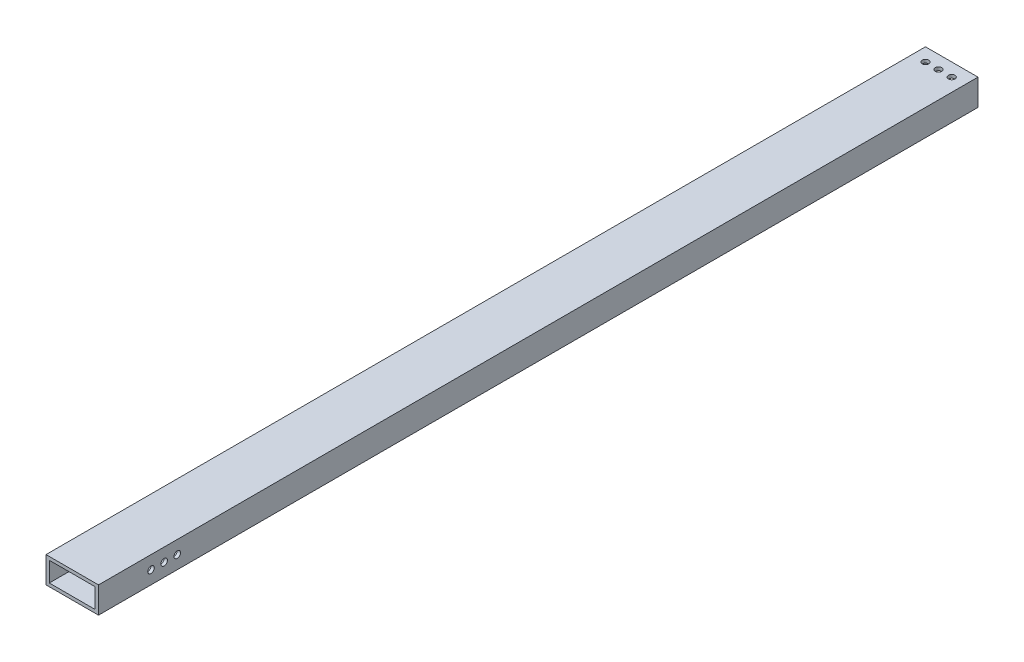
ISO-10303-21;
HEADER;
FILE_DESCRIPTION(('STEP AP214'),'2;1');
FILE_NAME('part.step','',(''),(''),'','','');
FILE_SCHEMA(('AUTOMOTIVE_DESIGN { 1 0 10303 214 1 1 1 1 }'));
ENDSEC;
DATA;
#1=APPLICATION_CONTEXT('core data for automotive mechanical design processes');
#2=APPLICATION_PROTOCOL_DEFINITION('international standard','automotive_design',2000,#1);
#3=PRODUCT_CONTEXT('',#1,'mechanical');
#4=PRODUCT('Part','Part','',(#3));
#5=PRODUCT_RELATED_PRODUCT_CATEGORY('part','',(#4));
#6=PRODUCT_DEFINITION_FORMATION('','',#4);
#7=PRODUCT_DEFINITION_CONTEXT('part definition',#1,'design');
#8=PRODUCT_DEFINITION('design','',#6,#7);
#9=PRODUCT_DEFINITION_SHAPE('','',#8);
#10=(LENGTH_UNIT() NAMED_UNIT(*) SI_UNIT(.MILLI.,.METRE.));
#11=(NAMED_UNIT(*) PLANE_ANGLE_UNIT() SI_UNIT($,.RADIAN.));
#12=(NAMED_UNIT(*) SI_UNIT($,.STERADIAN.) SOLID_ANGLE_UNIT());
#13=UNCERTAINTY_MEASURE_WITH_UNIT(LENGTH_MEASURE(1.E-05),#10,'distance_accuracy_value','');
#14=(GEOMETRIC_REPRESENTATION_CONTEXT(3) GLOBAL_UNCERTAINTY_ASSIGNED_CONTEXT((#13)) GLOBAL_UNIT_ASSIGNED_CONTEXT((#10,
#11,#12)) REPRESENTATION_CONTEXT('',''));
#15=CARTESIAN_POINT('',(0.,0.,0.));
#16=DIRECTION('',(0.,0.,1.));
#17=DIRECTION('',(1.,0.,0.));
#18=AXIS2_PLACEMENT_3D('',#15,#16,#17);
#19=CARTESIAN_POINT('',(0.,0.,850.9));
#20=DIRECTION('',(0.,0.,-1.));
#21=DIRECTION('',(-1.,0.,0.));
#22=AXIS2_PLACEMENT_3D('',#19,#20,#21);
#23=PLANE('',#22);
#24=DIRECTION('',(0.,-1.,0.));
#25=VECTOR('',#24,1.);
#26=CARTESIAN_POINT('',(0.,0.,850.9));
#27=LINE('',#26,#25);
#28=CARTESIAN_POINT('',(0.,25.4,850.9));
#29=VERTEX_POINT('',#28);
#30=CARTESIAN_POINT('',(0.,0.,850.9));
#31=VERTEX_POINT('',#30);
#32=EDGE_CURVE('E144',#29,#31,#27,.T.);
#33=ORIENTED_EDGE('',*,*,#32,.T.);
#34=DIRECTION('',(1.,0.,0.));
#35=VECTOR('',#34,1.);
#36=CARTESIAN_POINT('',(0.,0.,850.9));
#37=LINE('',#36,#35);
#38=CARTESIAN_POINT('',(50.8,0.,850.9));
#39=VERTEX_POINT('',#38);
#40=EDGE_CURVE('E147',#31,#39,#37,.T.);
#41=ORIENTED_EDGE('',*,*,#40,.T.);
#42=DIRECTION('',(0.,1.,0.));
#43=VECTOR('',#42,1.);
#44=CARTESIAN_POINT('',(50.8,0.,850.9));
#45=LINE('',#44,#43);
#46=CARTESIAN_POINT('',(50.8,25.4,850.9));
#47=VERTEX_POINT('',#46);
#48=EDGE_CURVE('E150',#39,#47,#45,.T.);
#49=ORIENTED_EDGE('',*,*,#48,.T.);
#50=DIRECTION('',(-1.,0.,0.));
#51=VECTOR('',#50,1.);
#52=CARTESIAN_POINT('',(0.,25.4,850.9));
#53=LINE('',#52,#51);
#54=EDGE_CURVE('E152',#47,#29,#53,.T.);
#55=ORIENTED_EDGE('',*,*,#54,.T.);
#56=EDGE_LOOP('',(#33,#41,#49,#55));
#57=FACE_BOUND('',#56,.T.);
#58=DIRECTION('',(0.,-1.,0.));
#59=VECTOR('',#58,1.);
#60=CARTESIAN_POINT('',(3.175,3.175,850.9));
#61=LINE('',#60,#59);
#62=CARTESIAN_POINT('',(3.175,22.225,850.9));
#63=VERTEX_POINT('',#62);
#64=CARTESIAN_POINT('',(3.175,3.175,850.9));
#65=VERTEX_POINT('',#64);
#66=EDGE_CURVE('E106',#63,#65,#61,.T.);
#67=ORIENTED_EDGE('',*,*,#66,.F.);
#68=DIRECTION('',(-1.,0.,0.));
#69=VECTOR('',#68,1.);
#70=CARTESIAN_POINT('',(3.175,22.225,850.9));
#71=LINE('',#70,#69);
#72=CARTESIAN_POINT('',(47.625,22.225,850.9));
#73=VERTEX_POINT('',#72);
#74=EDGE_CURVE('E128',#73,#63,#71,.T.);
#75=ORIENTED_EDGE('',*,*,#74,.F.);
#76=DIRECTION('',(0.,1.,0.));
#77=VECTOR('',#76,1.);
#78=CARTESIAN_POINT('',(47.625,3.175,850.9));
#79=LINE('',#78,#77);
#80=CARTESIAN_POINT('',(47.625,3.175,850.9));
#81=VERTEX_POINT('',#80);
#82=EDGE_CURVE('E126',#81,#73,#79,.T.);
#83=ORIENTED_EDGE('',*,*,#82,.F.);
#84=DIRECTION('',(1.,0.,0.));
#85=VECTOR('',#84,1.);
#86=CARTESIAN_POINT('',(3.175,3.175,850.9));
#87=LINE('',#86,#85);
#88=EDGE_CURVE('E114',#65,#81,#87,.T.);
#89=ORIENTED_EDGE('',*,*,#88,.F.);
#90=EDGE_LOOP('',(#67,#75,#83,#89));
#91=FACE_BOUND('',#90,.T.);
#92=ADVANCED_FACE('F39',(#57,#91),#23,.F.);
#93=CARTESIAN_POINT('',(0.,0.,0.));
#94=DIRECTION('',(0.,0.,-1.));
#95=DIRECTION('',(-1.,0.,0.));
#96=AXIS2_PLACEMENT_3D('',#93,#94,#95);
#97=PLANE('',#96);
#98=DIRECTION('',(0.,-1.,0.));
#99=VECTOR('',#98,1.);
#100=CARTESIAN_POINT('',(0.,0.,0.));
#101=LINE('',#100,#99);
#102=CARTESIAN_POINT('',(0.,25.4,0.));
#103=VERTEX_POINT('',#102);
#104=CARTESIAN_POINT('',(0.,0.,0.));
#105=VERTEX_POINT('',#104);
#106=EDGE_CURVE('E122',#103,#105,#101,.T.);
#107=ORIENTED_EDGE('',*,*,#106,.F.);
#108=DIRECTION('',(-1.,0.,0.));
#109=VECTOR('',#108,1.);
#110=CARTESIAN_POINT('',(0.,25.4,0.));
#111=LINE('',#110,#109);
#112=CARTESIAN_POINT('',(50.8,25.4,0.));
#113=VERTEX_POINT('',#112);
#114=EDGE_CURVE('E148',#113,#103,#111,.T.);
#115=ORIENTED_EDGE('',*,*,#114,.F.);
#116=DIRECTION('',(0.,1.,0.));
#117=VECTOR('',#116,1.);
#118=CARTESIAN_POINT('',(50.8,0.,0.));
#119=LINE('',#118,#117);
#120=CARTESIAN_POINT('',(50.8,0.,0.));
#121=VERTEX_POINT('',#120);
#122=EDGE_CURVE('E159',#121,#113,#119,.T.);
#123=ORIENTED_EDGE('',*,*,#122,.F.);
#124=DIRECTION('',(1.,0.,0.));
#125=VECTOR('',#124,1.);
#126=CARTESIAN_POINT('',(0.,0.,0.));
#127=LINE('',#126,#125);
#128=EDGE_CURVE('E157',#105,#121,#127,.T.);
#129=ORIENTED_EDGE('',*,*,#128,.F.);
#130=EDGE_LOOP('',(#107,#115,#123,#129));
#131=FACE_BOUND('',#130,.T.);
#132=DIRECTION('',(-1.,0.,0.));
#133=VECTOR('',#132,1.);
#134=CARTESIAN_POINT('',(3.175,22.225,0.));
#135=LINE('',#134,#133);
#136=CARTESIAN_POINT('',(47.625,22.225,0.));
#137=VERTEX_POINT('',#136);
#138=CARTESIAN_POINT('',(3.175,22.225,0.));
#139=VERTEX_POINT('',#138);
#140=EDGE_CURVE('E115',#137,#139,#135,.T.);
#141=ORIENTED_EDGE('',*,*,#140,.T.);
#142=DIRECTION('',(0.,-1.,0.));
#143=VECTOR('',#142,1.);
#144=CARTESIAN_POINT('',(3.175,3.175,0.));
#145=LINE('',#144,#143);
#146=CARTESIAN_POINT('',(3.175,3.175,0.));
#147=VERTEX_POINT('',#146);
#148=EDGE_CURVE('E64',#139,#147,#145,.T.);
#149=ORIENTED_EDGE('',*,*,#148,.T.);
#150=DIRECTION('',(1.,0.,0.));
#151=VECTOR('',#150,1.);
#152=CARTESIAN_POINT('',(3.175,3.175,0.));
#153=LINE('',#152,#151);
#154=CARTESIAN_POINT('',(47.625,3.175,0.));
#155=VERTEX_POINT('',#154);
#156=EDGE_CURVE('E121',#147,#155,#153,.T.);
#157=ORIENTED_EDGE('',*,*,#156,.T.);
#158=DIRECTION('',(0.,1.,0.));
#159=VECTOR('',#158,1.);
#160=CARTESIAN_POINT('',(47.625,3.175,0.));
#161=LINE('',#160,#159);
#162=EDGE_CURVE('E136',#155,#137,#161,.T.);
#163=ORIENTED_EDGE('',*,*,#162,.T.);
#164=EDGE_LOOP('',(#141,#149,#157,#163));
#165=FACE_BOUND('',#164,.T.);
#166=ADVANCED_FACE('F246',(#131,#165),#97,.T.);
#167=CARTESIAN_POINT('',(0.,0.,850.9));
#168=DIRECTION('',(1.,0.,0.));
#169=DIRECTION('',(0.,0.,-1.));
#170=AXIS2_PLACEMENT_3D('',#167,#168,#169);
#171=PLANE('',#170);
#172=CARTESIAN_POINT('',(0.,12.7,800.1));
#173=DIRECTION('',(1.,0.,0.));
#174=DIRECTION('',(0.,0.,-1.));
#175=AXIS2_PLACEMENT_3D('',#172,#173,#174);
#176=CIRCLE('',#175,3.17500000000008);
#177=CARTESIAN_POINT('',(0.,12.7,796.925));
#178=VERTEX_POINT('',#177);
#179=EDGE_CURVE('E173',#178,#178,#176,.T.);
#180=ORIENTED_EDGE('',*,*,#179,.T.);
#181=EDGE_LOOP('',(#180));
#182=FACE_BOUND('',#181,.T.);
#183=CARTESIAN_POINT('',(0.,12.7,787.4));
#184=DIRECTION('',(1.,0.,0.));
#185=DIRECTION('',(0.,0.,-1.));
#186=AXIS2_PLACEMENT_3D('',#183,#184,#185);
#187=CIRCLE('',#186,3.17500000000008);
#188=CARTESIAN_POINT('',(0.,12.7,784.225));
#189=VERTEX_POINT('',#188);
#190=EDGE_CURVE('E204',#189,#189,#187,.T.);
#191=ORIENTED_EDGE('',*,*,#190,.T.);
#192=EDGE_LOOP('',(#191));
#193=FACE_BOUND('',#192,.T.);
#194=CARTESIAN_POINT('',(0.,12.7,774.7));
#195=DIRECTION('',(1.,0.,0.));
#196=DIRECTION('',(0.,0.,-1.));
#197=AXIS2_PLACEMENT_3D('',#194,#195,#196);
#198=CIRCLE('',#197,3.17500000000008);
#199=CARTESIAN_POINT('',(0.,12.7,771.525));
#200=VERTEX_POINT('',#199);
#201=EDGE_CURVE('E190',#200,#200,#198,.T.);
#202=ORIENTED_EDGE('',*,*,#201,.T.);
#203=EDGE_LOOP('',(#202));
#204=FACE_BOUND('',#203,.T.);
#205=ORIENTED_EDGE('',*,*,#106,.T.);
#206=DIRECTION('',(0.,0.,-1.));
#207=VECTOR('',#206,1.);
#208=CARTESIAN_POINT('',(0.,0.,850.9));
#209=LINE('',#208,#207);
#210=EDGE_CURVE('E11',#31,#105,#209,.T.);
#211=ORIENTED_EDGE('',*,*,#210,.F.);
#212=ORIENTED_EDGE('',*,*,#32,.F.);
#213=DIRECTION('',(0.,0.,-1.));
#214=VECTOR('',#213,1.);
#215=CARTESIAN_POINT('',(0.,25.4,850.9));
#216=LINE('',#215,#214);
#217=EDGE_CURVE('E154',#29,#103,#216,.T.);
#218=ORIENTED_EDGE('',*,*,#217,.T.);
#219=EDGE_LOOP('',(#205,#211,#212,#218));
#220=FACE_BOUND('',#219,.T.);
#221=ADVANCED_FACE('F41',(#182,#193,#204,#220),#171,.F.);
#222=CARTESIAN_POINT('',(0.,0.,850.9));
#223=DIRECTION('',(0.,1.,0.));
#224=DIRECTION('',(0.,0.,1.));
#225=AXIS2_PLACEMENT_3D('',#222,#223,#224);
#226=PLANE('',#225);
#227=CARTESIAN_POINT('',(12.7,0.,12.7));
#228=DIRECTION('',(0.,1.,0.));
#229=DIRECTION('',(0.,0.,1.));
#230=AXIS2_PLACEMENT_3D('',#227,#228,#229);
#231=CIRCLE('',#230,3.17499999999999);
#232=CARTESIAN_POINT('',(12.7,0.,15.875));
#233=VERTEX_POINT('',#232);
#234=EDGE_CURVE('E272',#233,#233,#231,.T.);
#235=ORIENTED_EDGE('',*,*,#234,.T.);
#236=EDGE_LOOP('',(#235));
#237=FACE_BOUND('',#236,.T.);
#238=CARTESIAN_POINT('',(25.4,0.,12.7));
#239=DIRECTION('',(0.,1.,0.));
#240=DIRECTION('',(0.,0.,1.));
#241=AXIS2_PLACEMENT_3D('',#238,#239,#240);
#242=CIRCLE('',#241,3.17499999999999);
#243=CARTESIAN_POINT('',(25.4,0.,15.875));
#244=VERTEX_POINT('',#243);
#245=EDGE_CURVE('E275',#244,#244,#242,.T.);
#246=ORIENTED_EDGE('',*,*,#245,.T.);
#247=EDGE_LOOP('',(#246));
#248=FACE_BOUND('',#247,.T.);
#249=CARTESIAN_POINT('',(38.1,0.,12.7));
#250=DIRECTION('',(0.,1.,0.));
#251=DIRECTION('',(0.,0.,1.));
#252=AXIS2_PLACEMENT_3D('',#249,#250,#251);
#253=CIRCLE('',#252,3.175);
#254=CARTESIAN_POINT('',(38.1,0.,15.875));
#255=VERTEX_POINT('',#254);
#256=EDGE_CURVE('E186',#255,#255,#253,.T.);
#257=ORIENTED_EDGE('',*,*,#256,.T.);
#258=EDGE_LOOP('',(#257));
#259=FACE_BOUND('',#258,.T.);
#260=ORIENTED_EDGE('',*,*,#128,.T.);
#261=DIRECTION('',(0.,0.,-1.));
#262=VECTOR('',#261,1.);
#263=CARTESIAN_POINT('',(50.8,0.,850.9));
#264=LINE('',#263,#262);
#265=EDGE_CURVE('E48',#39,#121,#264,.T.);
#266=ORIENTED_EDGE('',*,*,#265,.F.);
#267=ORIENTED_EDGE('',*,*,#40,.F.);
#268=ORIENTED_EDGE('',*,*,#210,.T.);
#269=EDGE_LOOP('',(#260,#266,#267,#268));
#270=FACE_BOUND('',#269,.T.);
#271=ADVANCED_FACE('F262',(#237,#248,#259,#270),#226,.F.);
#272=CARTESIAN_POINT('',(50.8,0.,850.9));
#273=DIRECTION('',(-1.,0.,0.));
#274=DIRECTION('',(0.,0.,1.));
#275=AXIS2_PLACEMENT_3D('',#272,#273,#274);
#276=PLANE('',#275);
#277=CARTESIAN_POINT('',(50.8,12.7,800.1));
#278=DIRECTION('',(-1.,0.,0.));
#279=DIRECTION('',(0.,0.,1.));
#280=AXIS2_PLACEMENT_3D('',#277,#278,#279);
#281=CIRCLE('',#280,3.17500000000008);
#282=CARTESIAN_POINT('',(50.8,12.7,803.275));
#283=VERTEX_POINT('',#282);
#284=EDGE_CURVE('E134',#283,#283,#281,.T.);
#285=ORIENTED_EDGE('',*,*,#284,.T.);
#286=EDGE_LOOP('',(#285));
#287=FACE_BOUND('',#286,.T.);
#288=CARTESIAN_POINT('',(50.8,12.7,787.4));
#289=DIRECTION('',(-1.,0.,0.));
#290=DIRECTION('',(0.,0.,1.));
#291=AXIS2_PLACEMENT_3D('',#288,#289,#290);
#292=CIRCLE('',#291,3.17500000000008);
#293=CARTESIAN_POINT('',(50.8,12.7,790.575));
#294=VERTEX_POINT('',#293);
#295=EDGE_CURVE('E182',#294,#294,#292,.T.);
#296=ORIENTED_EDGE('',*,*,#295,.T.);
#297=EDGE_LOOP('',(#296));
#298=FACE_BOUND('',#297,.T.);
#299=CARTESIAN_POINT('',(50.8,12.7,774.7));
#300=DIRECTION('',(-1.,0.,0.));
#301=DIRECTION('',(0.,0.,1.));
#302=AXIS2_PLACEMENT_3D('',#299,#300,#301);
#303=CIRCLE('',#302,3.17500000000008);
#304=CARTESIAN_POINT('',(50.8,12.7,777.875));
#305=VERTEX_POINT('',#304);
#306=EDGE_CURVE('E178',#305,#305,#303,.T.);
#307=ORIENTED_EDGE('',*,*,#306,.T.);
#308=EDGE_LOOP('',(#307));
#309=FACE_BOUND('',#308,.T.);
#310=ORIENTED_EDGE('',*,*,#122,.T.);
#311=DIRECTION('',(0.,0.,-1.));
#312=VECTOR('',#311,1.);
#313=CARTESIAN_POINT('',(50.8,25.4,850.9));
#314=LINE('',#313,#312);
#315=EDGE_CURVE('E164',#47,#113,#314,.T.);
#316=ORIENTED_EDGE('',*,*,#315,.F.);
#317=ORIENTED_EDGE('',*,*,#48,.F.);
#318=ORIENTED_EDGE('',*,*,#265,.T.);
#319=EDGE_LOOP('',(#310,#316,#317,#318));
#320=FACE_BOUND('',#319,.T.);
#321=ADVANCED_FACE('F221',(#287,#298,#309,#320),#276,.F.);
#322=CARTESIAN_POINT('',(0.,25.4,850.9));
#323=DIRECTION('',(0.,-1.,0.));
#324=DIRECTION('',(0.,0.,-1.));
#325=AXIS2_PLACEMENT_3D('',#322,#323,#324);
#326=PLANE('',#325);
#327=CARTESIAN_POINT('',(12.7,25.4,12.7));
#328=DIRECTION('',(0.,1.,0.));
#329=DIRECTION('',(0.,0.,1.));
#330=AXIS2_PLACEMENT_3D('',#327,#328,#329);
#331=CIRCLE('',#330,3.175);
#332=CARTESIAN_POINT('',(12.7,25.4,15.875));
#333=VERTEX_POINT('',#332);
#334=EDGE_CURVE('E347',#333,#333,#331,.T.);
#335=ORIENTED_EDGE('',*,*,#334,.F.);
#336=EDGE_LOOP('',(#335));
#337=FACE_BOUND('',#336,.T.);
#338=CARTESIAN_POINT('',(25.4,25.4,12.7));
#339=DIRECTION('',(0.,1.,0.));
#340=DIRECTION('',(0.,0.,1.));
#341=AXIS2_PLACEMENT_3D('',#338,#339,#340);
#342=CIRCLE('',#341,3.175);
#343=CARTESIAN_POINT('',(25.4,25.4,15.875));
#344=VERTEX_POINT('',#343);
#345=EDGE_CURVE('E352',#344,#344,#342,.T.);
#346=ORIENTED_EDGE('',*,*,#345,.F.);
#347=EDGE_LOOP('',(#346));
#348=FACE_BOUND('',#347,.T.);
#349=CARTESIAN_POINT('',(38.1,25.4,12.7));
#350=DIRECTION('',(0.,1.,0.));
#351=DIRECTION('',(0.,0.,1.));
#352=AXIS2_PLACEMENT_3D('',#349,#350,#351);
#353=CIRCLE('',#352,3.175);
#354=CARTESIAN_POINT('',(38.1,25.4,15.875));
#355=VERTEX_POINT('',#354);
#356=EDGE_CURVE('E193',#355,#355,#353,.T.);
#357=ORIENTED_EDGE('',*,*,#356,.F.);
#358=EDGE_LOOP('',(#357));
#359=FACE_BOUND('',#358,.T.);
#360=ORIENTED_EDGE('',*,*,#114,.T.);
#361=ORIENTED_EDGE('',*,*,#217,.F.);
#362=ORIENTED_EDGE('',*,*,#54,.F.);
#363=ORIENTED_EDGE('',*,*,#315,.T.);
#364=EDGE_LOOP('',(#360,#361,#362,#363));
#365=FACE_BOUND('',#364,.T.);
#366=ADVANCED_FACE('F257',(#337,#348,#359,#365),#326,.F.);
#367=CARTESIAN_POINT('',(3.175,3.175,850.9));
#368=DIRECTION('',(1.,0.,0.));
#369=DIRECTION('',(0.,0.,-1.));
#370=AXIS2_PLACEMENT_3D('',#367,#368,#369);
#371=PLANE('',#370);
#372=CARTESIAN_POINT('',(3.175,12.7,800.1));
#373=DIRECTION('',(1.,0.,0.));
#374=DIRECTION('',(0.,0.,-1.));
#375=AXIS2_PLACEMENT_3D('',#372,#373,#374);
#376=CIRCLE('',#375,3.17500000000008);
#377=CARTESIAN_POINT('',(3.175,12.7,796.925));
#378=VERTEX_POINT('',#377);
#379=EDGE_CURVE('E181',#378,#378,#376,.T.);
#380=ORIENTED_EDGE('',*,*,#379,.F.);
#381=EDGE_LOOP('',(#380));
#382=FACE_BOUND('',#381,.T.);
#383=CARTESIAN_POINT('',(3.175,12.7,787.4));
#384=DIRECTION('',(1.,0.,0.));
#385=DIRECTION('',(0.,0.,-1.));
#386=AXIS2_PLACEMENT_3D('',#383,#384,#385);
#387=CIRCLE('',#386,3.17500000000008);
#388=CARTESIAN_POINT('',(3.175,12.7,784.225));
#389=VERTEX_POINT('',#388);
#390=EDGE_CURVE('E177',#389,#389,#387,.T.);
#391=ORIENTED_EDGE('',*,*,#390,.F.);
#392=EDGE_LOOP('',(#391));
#393=FACE_BOUND('',#392,.T.);
#394=CARTESIAN_POINT('',(3.175,12.7,774.7));
#395=DIRECTION('',(1.,0.,0.));
#396=DIRECTION('',(0.,0.,-1.));
#397=AXIS2_PLACEMENT_3D('',#394,#395,#396);
#398=CIRCLE('',#397,3.17500000000008);
#399=CARTESIAN_POINT('',(3.175,12.7,771.525));
#400=VERTEX_POINT('',#399);
#401=EDGE_CURVE('E172',#400,#400,#398,.T.);
#402=ORIENTED_EDGE('',*,*,#401,.F.);
#403=EDGE_LOOP('',(#402));
#404=FACE_BOUND('',#403,.T.);
#405=ORIENTED_EDGE('',*,*,#148,.F.);
#406=DIRECTION('',(0.,0.,-1.));
#407=VECTOR('',#406,1.);
#408=CARTESIAN_POINT('',(3.175,22.225,850.9));
#409=LINE('',#408,#407);
#410=EDGE_CURVE('E110',#63,#139,#409,.T.);
#411=ORIENTED_EDGE('',*,*,#410,.F.);
#412=ORIENTED_EDGE('',*,*,#66,.T.);
#413=DIRECTION('',(0.,0.,-1.));
#414=VECTOR('',#413,1.);
#415=CARTESIAN_POINT('',(3.175,3.175,850.9));
#416=LINE('',#415,#414);
#417=EDGE_CURVE('E109',#65,#147,#416,.T.);
#418=ORIENTED_EDGE('',*,*,#417,.T.);
#419=EDGE_LOOP('',(#405,#411,#412,#418));
#420=FACE_BOUND('',#419,.T.);
#421=ADVANCED_FACE('F108',(#382,#393,#404,#420),#371,.T.);
#422=CARTESIAN_POINT('',(3.175,3.175,850.9));
#423=DIRECTION('',(0.,1.,0.));
#424=DIRECTION('',(0.,0.,1.));
#425=AXIS2_PLACEMENT_3D('',#422,#423,#424);
#426=PLANE('',#425);
#427=CARTESIAN_POINT('',(12.7,3.175,12.7));
#428=DIRECTION('',(0.,1.,0.));
#429=DIRECTION('',(0.,0.,1.));
#430=AXIS2_PLACEMENT_3D('',#427,#428,#429);
#431=CIRCLE('',#430,3.175);
#432=CARTESIAN_POINT('',(12.7,3.175,15.875));
#433=VERTEX_POINT('',#432);
#434=EDGE_CURVE('E316',#433,#433,#431,.T.);
#435=ORIENTED_EDGE('',*,*,#434,.F.);
#436=EDGE_LOOP('',(#435));
#437=FACE_BOUND('',#436,.T.);
#438=CARTESIAN_POINT('',(25.4,3.175,12.7));
#439=DIRECTION('',(0.,1.,0.));
#440=DIRECTION('',(0.,0.,1.));
#441=AXIS2_PLACEMENT_3D('',#438,#439,#440);
#442=CIRCLE('',#441,3.175);
#443=CARTESIAN_POINT('',(25.4,3.175,15.875));
#444=VERTEX_POINT('',#443);
#445=EDGE_CURVE('E198',#444,#444,#442,.T.);
#446=ORIENTED_EDGE('',*,*,#445,.F.);
#447=EDGE_LOOP('',(#446));
#448=FACE_BOUND('',#447,.T.);
#449=CARTESIAN_POINT('',(38.1,3.175,12.7));
#450=DIRECTION('',(0.,1.,0.));
#451=DIRECTION('',(0.,0.,1.));
#452=AXIS2_PLACEMENT_3D('',#449,#450,#451);
#453=CIRCLE('',#452,3.175);
#454=CARTESIAN_POINT('',(38.1,3.175,15.875));
#455=VERTEX_POINT('',#454);
#456=EDGE_CURVE('E185',#455,#455,#453,.T.);
#457=ORIENTED_EDGE('',*,*,#456,.F.);
#458=EDGE_LOOP('',(#457));
#459=FACE_BOUND('',#458,.T.);
#460=ORIENTED_EDGE('',*,*,#156,.F.);
#461=ORIENTED_EDGE('',*,*,#417,.F.);
#462=ORIENTED_EDGE('',*,*,#88,.T.);
#463=DIRECTION('',(0.,0.,-1.));
#464=VECTOR('',#463,1.);
#465=CARTESIAN_POINT('',(47.625,3.175,850.9));
#466=LINE('',#465,#464);
#467=EDGE_CURVE('E123',#81,#155,#466,.T.);
#468=ORIENTED_EDGE('',*,*,#467,.T.);
#469=EDGE_LOOP('',(#460,#461,#462,#468));
#470=FACE_BOUND('',#469,.T.);
#471=ADVANCED_FACE('F118',(#437,#448,#459,#470),#426,.T.);
#472=CARTESIAN_POINT('',(47.625,3.175,850.9));
#473=DIRECTION('',(-1.,0.,0.));
#474=DIRECTION('',(0.,0.,1.));
#475=AXIS2_PLACEMENT_3D('',#472,#473,#474);
#476=PLANE('',#475);
#477=CARTESIAN_POINT('',(47.625,12.7,800.1));
#478=DIRECTION('',(-1.,0.,0.));
#479=DIRECTION('',(0.,0.,1.));
#480=AXIS2_PLACEMENT_3D('',#477,#478,#479);
#481=CIRCLE('',#480,3.17500000000008);
#482=CARTESIAN_POINT('',(47.625,12.7,803.275));
#483=VERTEX_POINT('',#482);
#484=EDGE_CURVE('E179',#483,#483,#481,.T.);
#485=ORIENTED_EDGE('',*,*,#484,.F.);
#486=EDGE_LOOP('',(#485));
#487=FACE_BOUND('',#486,.T.);
#488=CARTESIAN_POINT('',(47.625,12.7,787.4));
#489=DIRECTION('',(-1.,0.,0.));
#490=DIRECTION('',(0.,0.,1.));
#491=AXIS2_PLACEMENT_3D('',#488,#489,#490);
#492=CIRCLE('',#491,3.17500000000008);
#493=CARTESIAN_POINT('',(47.625,12.7,790.575));
#494=VERTEX_POINT('',#493);
#495=EDGE_CURVE('E174',#494,#494,#492,.T.);
#496=ORIENTED_EDGE('',*,*,#495,.F.);
#497=EDGE_LOOP('',(#496));
#498=FACE_BOUND('',#497,.T.);
#499=CARTESIAN_POINT('',(47.625,12.7,774.7));
#500=DIRECTION('',(-1.,0.,0.));
#501=DIRECTION('',(0.,0.,1.));
#502=AXIS2_PLACEMENT_3D('',#499,#500,#501);
#503=CIRCLE('',#502,3.17500000000008);
#504=CARTESIAN_POINT('',(47.625,12.7,777.875));
#505=VERTEX_POINT('',#504);
#506=EDGE_CURVE('E169',#505,#505,#503,.T.);
#507=ORIENTED_EDGE('',*,*,#506,.F.);
#508=EDGE_LOOP('',(#507));
#509=FACE_BOUND('',#508,.T.);
#510=ORIENTED_EDGE('',*,*,#162,.F.);
#511=ORIENTED_EDGE('',*,*,#467,.F.);
#512=ORIENTED_EDGE('',*,*,#82,.T.);
#513=DIRECTION('',(0.,0.,-1.));
#514=VECTOR('',#513,1.);
#515=CARTESIAN_POINT('',(47.625,22.225,850.9));
#516=LINE('',#515,#514);
#517=EDGE_CURVE('E56',#73,#137,#516,.T.);
#518=ORIENTED_EDGE('',*,*,#517,.T.);
#519=EDGE_LOOP('',(#510,#511,#512,#518));
#520=FACE_BOUND('',#519,.T.);
#521=ADVANCED_FACE('F294',(#487,#498,#509,#520),#476,.T.);
#522=CARTESIAN_POINT('',(3.175,22.225,850.9));
#523=DIRECTION('',(0.,-1.,0.));
#524=DIRECTION('',(0.,0.,-1.));
#525=AXIS2_PLACEMENT_3D('',#522,#523,#524);
#526=PLANE('',#525);
#527=CARTESIAN_POINT('',(12.7,22.225,12.7));
#528=DIRECTION('',(0.,-1.,0.));
#529=DIRECTION('',(0.,0.,-1.));
#530=AXIS2_PLACEMENT_3D('',#527,#528,#529);
#531=CIRCLE('',#530,3.175);
#532=CARTESIAN_POINT('',(12.7,22.225,9.52500000000005));
#533=VERTEX_POINT('',#532);
#534=EDGE_CURVE('E43',#533,#533,#531,.T.);
#535=ORIENTED_EDGE('',*,*,#534,.F.);
#536=EDGE_LOOP('',(#535));
#537=FACE_BOUND('',#536,.T.);
#538=CARTESIAN_POINT('',(25.4,22.225,12.7));
#539=DIRECTION('',(0.,-1.,0.));
#540=DIRECTION('',(0.,0.,-1.));
#541=AXIS2_PLACEMENT_3D('',#538,#539,#540);
#542=CIRCLE('',#541,3.175);
#543=CARTESIAN_POINT('',(25.4,22.225,9.52500000000005));
#544=VERTEX_POINT('',#543);
#545=EDGE_CURVE('E356',#544,#544,#542,.T.);
#546=ORIENTED_EDGE('',*,*,#545,.F.);
#547=EDGE_LOOP('',(#546));
#548=FACE_BOUND('',#547,.T.);
#549=CARTESIAN_POINT('',(38.1,22.225,12.7));
#550=DIRECTION('',(0.,-1.,0.));
#551=DIRECTION('',(0.,0.,-1.));
#552=AXIS2_PLACEMENT_3D('',#549,#550,#551);
#553=CIRCLE('',#552,3.175);
#554=CARTESIAN_POINT('',(38.1,22.225,9.525));
#555=VERTEX_POINT('',#554);
#556=EDGE_CURVE('E183',#555,#555,#553,.T.);
#557=ORIENTED_EDGE('',*,*,#556,.F.);
#558=EDGE_LOOP('',(#557));
#559=FACE_BOUND('',#558,.T.);
#560=ORIENTED_EDGE('',*,*,#140,.F.);
#561=ORIENTED_EDGE('',*,*,#517,.F.);
#562=ORIENTED_EDGE('',*,*,#74,.T.);
#563=ORIENTED_EDGE('',*,*,#410,.T.);
#564=EDGE_LOOP('',(#560,#561,#562,#563));
#565=FACE_BOUND('',#564,.T.);
#566=ADVANCED_FACE('F292',(#537,#548,#559,#565),#526,.T.);
#567=CARTESIAN_POINT('',(0.,12.7,774.7));
#568=DIRECTION('',(1.,0.,0.));
#569=DIRECTION('',(0.,0.,-1.));
#570=AXIS2_PLACEMENT_3D('',#567,#568,#569);
#571=CYLINDRICAL_SURFACE('',#570,3.17500000000008);
#572=ORIENTED_EDGE('',*,*,#506,.T.);
#573=EDGE_LOOP('',(#572));
#574=FACE_BOUND('',#573,.T.);
#575=ORIENTED_EDGE('',*,*,#306,.F.);
#576=EDGE_LOOP('',(#575));
#577=FACE_BOUND('',#576,.T.);
#578=ADVANCED_FACE('F238',(#574,#577),#571,.F.);
#579=CARTESIAN_POINT('',(0.,12.7,787.4));
#580=DIRECTION('',(1.,0.,0.));
#581=DIRECTION('',(0.,0.,-1.));
#582=AXIS2_PLACEMENT_3D('',#579,#580,#581);
#583=CYLINDRICAL_SURFACE('',#582,3.17500000000008);
#584=ORIENTED_EDGE('',*,*,#495,.T.);
#585=EDGE_LOOP('',(#584));
#586=FACE_BOUND('',#585,.T.);
#587=ORIENTED_EDGE('',*,*,#295,.F.);
#588=EDGE_LOOP('',(#587));
#589=FACE_BOUND('',#588,.T.);
#590=ADVANCED_FACE('F227',(#586,#589),#583,.F.);
#591=CARTESIAN_POINT('',(0.,12.7,800.1));
#592=DIRECTION('',(1.,0.,0.));
#593=DIRECTION('',(0.,0.,-1.));
#594=AXIS2_PLACEMENT_3D('',#591,#592,#593);
#595=CYLINDRICAL_SURFACE('',#594,3.17500000000008);
#596=ORIENTED_EDGE('',*,*,#484,.T.);
#597=EDGE_LOOP('',(#596));
#598=FACE_BOUND('',#597,.T.);
#599=ORIENTED_EDGE('',*,*,#284,.F.);
#600=EDGE_LOOP('',(#599));
#601=FACE_BOUND('',#600,.T.);
#602=ADVANCED_FACE('F224',(#598,#601),#595,.F.);
#603=ORIENTED_EDGE('',*,*,#401,.T.);
#604=EDGE_LOOP('',(#603));
#605=FACE_BOUND('',#604,.T.);
#606=ORIENTED_EDGE('',*,*,#201,.F.);
#607=EDGE_LOOP('',(#606));
#608=FACE_BOUND('',#607,.T.);
#609=ADVANCED_FACE('F226',(#605,#608),#571,.F.);
#610=ORIENTED_EDGE('',*,*,#390,.T.);
#611=EDGE_LOOP('',(#610));
#612=FACE_BOUND('',#611,.T.);
#613=ORIENTED_EDGE('',*,*,#190,.F.);
#614=EDGE_LOOP('',(#613));
#615=FACE_BOUND('',#614,.T.);
#616=ADVANCED_FACE('F235',(#612,#615),#583,.F.);
#617=ORIENTED_EDGE('',*,*,#379,.T.);
#618=EDGE_LOOP('',(#617));
#619=FACE_BOUND('',#618,.T.);
#620=ORIENTED_EDGE('',*,*,#179,.F.);
#621=EDGE_LOOP('',(#620));
#622=FACE_BOUND('',#621,.T.);
#623=ADVANCED_FACE('F230',(#619,#622),#595,.F.);
#624=CARTESIAN_POINT('',(38.1,25.4,12.7));
#625=DIRECTION('',(0.,1.,0.));
#626=DIRECTION('',(0.,0.,1.));
#627=AXIS2_PLACEMENT_3D('',#624,#625,#626);
#628=CYLINDRICAL_SURFACE('',#627,3.175);
#629=ORIENTED_EDGE('',*,*,#556,.T.);
#630=EDGE_LOOP('',(#629));
#631=FACE_BOUND('',#630,.T.);
#632=ORIENTED_EDGE('',*,*,#356,.T.);
#633=EDGE_LOOP('',(#632));
#634=FACE_BOUND('',#633,.T.);
#635=ADVANCED_FACE('F243',(#631,#634),#628,.F.);
#636=ORIENTED_EDGE('',*,*,#456,.T.);
#637=EDGE_LOOP('',(#636));
#638=FACE_BOUND('',#637,.T.);
#639=ORIENTED_EDGE('',*,*,#256,.F.);
#640=EDGE_LOOP('',(#639));
#641=FACE_BOUND('',#640,.T.);
#642=ADVANCED_FACE('F322',(#638,#641),#628,.F.);
#643=CARTESIAN_POINT('',(25.4,25.4,12.7));
#644=DIRECTION('',(0.,1.,0.));
#645=DIRECTION('',(0.,0.,1.));
#646=AXIS2_PLACEMENT_3D('',#643,#644,#645);
#647=CYLINDRICAL_SURFACE('',#646,3.175);
#648=ORIENTED_EDGE('',*,*,#545,.T.);
#649=EDGE_LOOP('',(#648));
#650=FACE_BOUND('',#649,.T.);
#651=ORIENTED_EDGE('',*,*,#345,.T.);
#652=EDGE_LOOP('',(#651));
#653=FACE_BOUND('',#652,.T.);
#654=ADVANCED_FACE('F325',(#650,#653),#647,.F.);
#655=ORIENTED_EDGE('',*,*,#445,.T.);
#656=EDGE_LOOP('',(#655));
#657=FACE_BOUND('',#656,.T.);
#658=ORIENTED_EDGE('',*,*,#245,.F.);
#659=EDGE_LOOP('',(#658));
#660=FACE_BOUND('',#659,.T.);
#661=ADVANCED_FACE('F329',(#657,#660),#647,.F.);
#662=CARTESIAN_POINT('',(12.7,25.4,12.7));
#663=DIRECTION('',(0.,1.,0.));
#664=DIRECTION('',(0.,0.,1.));
#665=AXIS2_PLACEMENT_3D('',#662,#663,#664);
#666=CYLINDRICAL_SURFACE('',#665,3.175);
#667=ORIENTED_EDGE('',*,*,#534,.T.);
#668=EDGE_LOOP('',(#667));
#669=FACE_BOUND('',#668,.T.);
#670=ORIENTED_EDGE('',*,*,#334,.T.);
#671=EDGE_LOOP('',(#670));
#672=FACE_BOUND('',#671,.T.);
#673=ADVANCED_FACE('F333',(#669,#672),#666,.F.);
#674=ORIENTED_EDGE('',*,*,#434,.T.);
#675=EDGE_LOOP('',(#674));
#676=FACE_BOUND('',#675,.T.);
#677=ORIENTED_EDGE('',*,*,#234,.F.);
#678=EDGE_LOOP('',(#677));
#679=FACE_BOUND('',#678,.T.);
#680=ADVANCED_FACE('F335',(#676,#679),#666,.F.);
#681=CLOSED_SHELL('',(#92,#166,#221,#271,#321,#366,#421,#471,#521,#566,#578,#590,#602,#609,#616,
#623,#635,#642,#654,#661,#673,#680));
#682=MANIFOLD_SOLID_BREP('B2',#681);
#683=ADVANCED_BREP_SHAPE_REPRESENTATION('',(#18,#682),#14);
#684=SHAPE_DEFINITION_REPRESENTATION(#9,#683);
ENDSEC;
END-ISO-10303-21;
